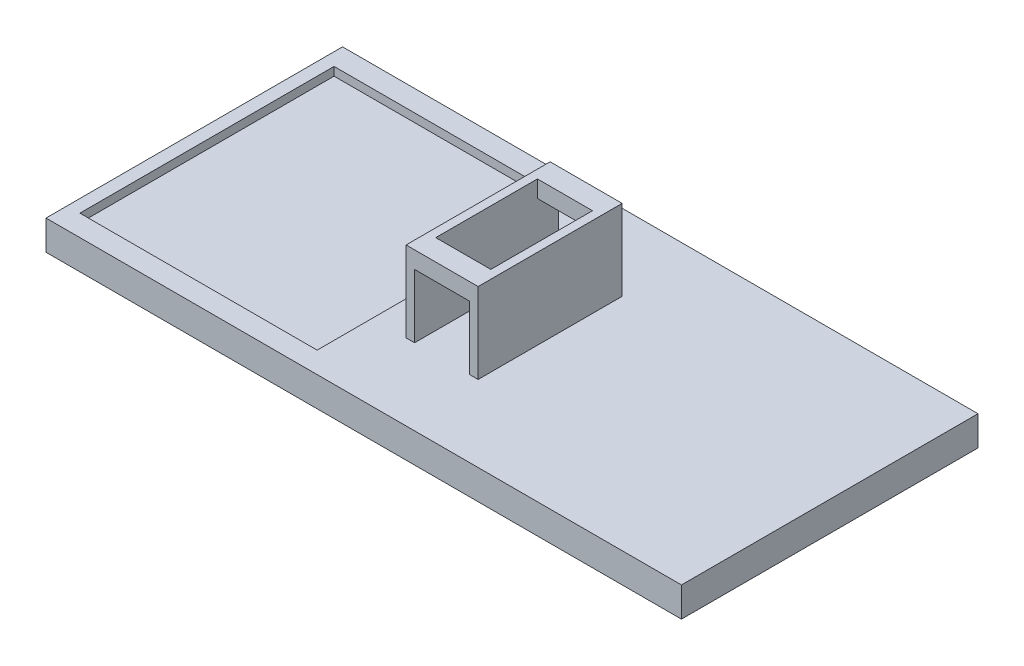
ISO-10303-21;
HEADER;
FILE_DESCRIPTION(('STEP AP214'),'2;1');
FILE_NAME('part.step','',(''),(''),'','','');
FILE_SCHEMA(('AUTOMOTIVE_DESIGN { 1 0 10303 214 1 1 1 1 }'));
ENDSEC;
DATA;
#1=APPLICATION_CONTEXT('core data for automotive mechanical design processes');
#2=APPLICATION_PROTOCOL_DEFINITION('international standard','automotive_design',2000,#1);
#3=PRODUCT_CONTEXT('',#1,'mechanical');
#4=PRODUCT('Part','Part','',(#3));
#5=PRODUCT_RELATED_PRODUCT_CATEGORY('part','',(#4));
#6=PRODUCT_DEFINITION_FORMATION('','',#4);
#7=PRODUCT_DEFINITION_CONTEXT('part definition',#1,'design');
#8=PRODUCT_DEFINITION('design','',#6,#7);
#9=PRODUCT_DEFINITION_SHAPE('','',#8);
#10=(LENGTH_UNIT() NAMED_UNIT(*) SI_UNIT(.MILLI.,.METRE.));
#11=(NAMED_UNIT(*) PLANE_ANGLE_UNIT() SI_UNIT($,.RADIAN.));
#12=(NAMED_UNIT(*) SI_UNIT($,.STERADIAN.) SOLID_ANGLE_UNIT());
#13=UNCERTAINTY_MEASURE_WITH_UNIT(LENGTH_MEASURE(1.E-05),#10,'distance_accuracy_value','');
#14=(GEOMETRIC_REPRESENTATION_CONTEXT(3) GLOBAL_UNCERTAINTY_ASSIGNED_CONTEXT((#13)) GLOBAL_UNIT_ASSIGNED_CONTEXT((#10,
#11,#12)) REPRESENTATION_CONTEXT('',''));
#15=CARTESIAN_POINT('',(0.,0.,0.));
#16=DIRECTION('',(0.,0.,1.));
#17=DIRECTION('',(1.,0.,0.));
#18=AXIS2_PLACEMENT_3D('',#15,#16,#17);
#19=CARTESIAN_POINT('',(0.,5.,0.));
#20=DIRECTION('',(0.,0.,-1.));
#21=DIRECTION('',(-1.,0.,0.));
#22=AXIS2_PLACEMENT_3D('',#19,#20,#21);
#23=PLANE('',#22);
#24=DIRECTION('',(1.,0.,0.));
#25=VECTOR('',#24,1.);
#26=CARTESIAN_POINT('',(0.,0.,0.));
#27=LINE('',#26,#25);
#28=CARTESIAN_POINT('',(0.,0.,0.));
#29=VERTEX_POINT('',#28);
#30=CARTESIAN_POINT('',(150.,0.,0.));
#31=VERTEX_POINT('',#30);
#32=EDGE_CURVE('E283',#29,#31,#27,.T.);
#33=ORIENTED_EDGE('',*,*,#32,.T.);
#34=DIRECTION('',(0.,-1.,0.));
#35=VECTOR('',#34,1.);
#36=CARTESIAN_POINT('',(150.,5.,0.));
#37=LINE('',#36,#35);
#38=CARTESIAN_POINT('',(150.,7.,0.));
#39=VERTEX_POINT('',#38);
#40=EDGE_CURVE('E288',#39,#31,#37,.T.);
#41=ORIENTED_EDGE('',*,*,#40,.F.);
#42=DIRECTION('',(1.,0.,0.));
#43=VECTOR('',#42,1.);
#44=CARTESIAN_POINT('',(0.,7.,0.));
#45=LINE('',#44,#43);
#46=CARTESIAN_POINT('',(0.,7.,0.));
#47=VERTEX_POINT('',#46);
#48=EDGE_CURVE('E253',#47,#39,#45,.T.);
#49=ORIENTED_EDGE('',*,*,#48,.F.);
#50=DIRECTION('',(0.,-1.,0.));
#51=VECTOR('',#50,1.);
#52=CARTESIAN_POINT('',(0.,5.,0.));
#53=LINE('',#52,#51);
#54=EDGE_CURVE('E42',#47,#29,#53,.T.);
#55=ORIENTED_EDGE('',*,*,#54,.T.);
#56=EDGE_LOOP('',(#33,#41,#49,#55));
#57=FACE_BOUND('',#56,.T.);
#58=ADVANCED_FACE('F34',(#57),#23,.F.);
#59=CARTESIAN_POINT('',(150.,5.,0.));
#60=DIRECTION('',(-1.,0.,0.));
#61=DIRECTION('',(0.,0.,1.));
#62=AXIS2_PLACEMENT_3D('',#59,#60,#61);
#63=PLANE('',#62);
#64=DIRECTION('',(0.,0.,-1.));
#65=VECTOR('',#64,1.);
#66=CARTESIAN_POINT('',(150.,0.,0.));
#67=LINE('',#66,#65);
#68=CARTESIAN_POINT('',(150.,0.,-70.));
#69=VERTEX_POINT('',#68);
#70=EDGE_CURVE('E280',#31,#69,#67,.T.);
#71=ORIENTED_EDGE('',*,*,#70,.T.);
#72=DIRECTION('',(0.,-1.,0.));
#73=VECTOR('',#72,1.);
#74=CARTESIAN_POINT('',(150.,5.,-70.));
#75=LINE('',#74,#73);
#76=CARTESIAN_POINT('',(150.,7.,-70.));
#77=VERTEX_POINT('',#76);
#78=EDGE_CURVE('E291',#77,#69,#75,.T.);
#79=ORIENTED_EDGE('',*,*,#78,.F.);
#80=DIRECTION('',(0.,0.,-1.));
#81=VECTOR('',#80,1.);
#82=CARTESIAN_POINT('',(150.,7.,0.));
#83=LINE('',#82,#81);
#84=EDGE_CURVE('E256',#39,#77,#83,.T.);
#85=ORIENTED_EDGE('',*,*,#84,.F.);
#86=ORIENTED_EDGE('',*,*,#40,.T.);
#87=EDGE_LOOP('',(#71,#79,#85,#86));
#88=FACE_BOUND('',#87,.T.);
#89=ADVANCED_FACE('F306',(#88),#63,.F.);
#90=CARTESIAN_POINT('',(0.,5.,-70.));
#91=DIRECTION('',(0.,0.,-1.));
#92=DIRECTION('',(-1.,0.,0.));
#93=AXIS2_PLACEMENT_3D('',#90,#91,#92);
#94=PLANE('',#93);
#95=DIRECTION('',(1.,0.,0.));
#96=VECTOR('',#95,1.);
#97=CARTESIAN_POINT('',(0.,0.,-70.));
#98=LINE('',#97,#96);
#99=CARTESIAN_POINT('',(0.,0.,-70.));
#100=VERTEX_POINT('',#99);
#101=EDGE_CURVE('E277',#100,#69,#98,.T.);
#102=ORIENTED_EDGE('',*,*,#101,.F.);
#103=DIRECTION('',(0.,-1.,0.));
#104=VECTOR('',#103,1.);
#105=CARTESIAN_POINT('',(0.,5.,-70.));
#106=LINE('',#105,#104);
#107=CARTESIAN_POINT('',(0.,7.,-70.));
#108=VERTEX_POINT('',#107);
#109=EDGE_CURVE('E285',#108,#100,#106,.T.);
#110=ORIENTED_EDGE('',*,*,#109,.F.);
#111=DIRECTION('',(-1.,0.,0.));
#112=VECTOR('',#111,1.);
#113=CARTESIAN_POINT('',(0.,7.,-70.));
#114=LINE('',#113,#112);
#115=EDGE_CURVE('E259',#77,#108,#114,.T.);
#116=ORIENTED_EDGE('',*,*,#115,.F.);
#117=ORIENTED_EDGE('',*,*,#78,.T.);
#118=EDGE_LOOP('',(#102,#110,#116,#117));
#119=FACE_BOUND('',#118,.T.);
#120=ADVANCED_FACE('F297',(#119),#94,.T.);
#121=CARTESIAN_POINT('',(0.,5.,-5.));
#122=DIRECTION('',(-1.,0.,0.));
#123=DIRECTION('',(0.,0.,1.));
#124=AXIS2_PLACEMENT_3D('',#121,#122,#123);
#125=PLANE('',#124);
#126=DIRECTION('',(0.,0.,-1.));
#127=VECTOR('',#126,1.);
#128=CARTESIAN_POINT('',(0.,0.,-5.));
#129=LINE('',#128,#127);
#130=EDGE_CURVE('E274',#29,#100,#129,.T.);
#131=ORIENTED_EDGE('',*,*,#130,.F.);
#132=ORIENTED_EDGE('',*,*,#54,.F.);
#133=DIRECTION('',(0.,0.,1.));
#134=VECTOR('',#133,1.);
#135=CARTESIAN_POINT('',(0.,7.,0.));
#136=LINE('',#135,#134);
#137=EDGE_CURVE('E250',#108,#47,#136,.T.);
#138=ORIENTED_EDGE('',*,*,#137,.F.);
#139=ORIENTED_EDGE('',*,*,#109,.T.);
#140=EDGE_LOOP('',(#131,#132,#138,#139));
#141=FACE_BOUND('',#140,.T.);
#142=ADVANCED_FACE('F36',(#141),#125,.T.);
#143=CARTESIAN_POINT('',(0.,0.,0.));
#144=DIRECTION('',(0.,-1.,0.));
#145=DIRECTION('',(0.,0.,-1.));
#146=AXIS2_PLACEMENT_3D('',#143,#144,#145);
#147=PLANE('',#146);
#148=ORIENTED_EDGE('',*,*,#32,.F.);
#149=ORIENTED_EDGE('',*,*,#130,.T.);
#150=ORIENTED_EDGE('',*,*,#101,.T.);
#151=ORIENTED_EDGE('',*,*,#70,.F.);
#152=EDGE_LOOP('',(#148,#149,#150,#151));
#153=FACE_BOUND('',#152,.T.);
#154=ADVANCED_FACE('F301',(#153),#147,.T.);
#155=CARTESIAN_POINT('',(59.,7.,-65.));
#156=DIRECTION('',(-1.,0.,0.));
#157=DIRECTION('',(0.,0.,1.));
#158=AXIS2_PLACEMENT_3D('',#155,#156,#157);
#159=PLANE('',#158);
#160=DIRECTION('',(0.,0.,-1.));
#161=VECTOR('',#160,1.);
#162=CARTESIAN_POINT('',(59.,5.,0.));
#163=LINE('',#162,#161);
#164=CARTESIAN_POINT('',(59.,5.,-5.));
#165=VERTEX_POINT('',#164);
#166=CARTESIAN_POINT('',(59.,5.,-65.));
#167=VERTEX_POINT('',#166);
#168=EDGE_CURVE('E271',#165,#167,#163,.T.);
#169=ORIENTED_EDGE('',*,*,#168,.F.);
#170=DIRECTION('',(0.,-1.,0.));
#171=VECTOR('',#170,1.);
#172=CARTESIAN_POINT('',(59.,7.,-5.));
#173=LINE('',#172,#171);
#174=CARTESIAN_POINT('',(59.,7.,-5.));
#175=VERTEX_POINT('',#174);
#176=EDGE_CURVE('E239',#175,#165,#173,.T.);
#177=ORIENTED_EDGE('',*,*,#176,.F.);
#178=DIRECTION('',(0.,0.,-1.));
#179=VECTOR('',#178,1.);
#180=CARTESIAN_POINT('',(59.,7.,-65.));
#181=LINE('',#180,#179);
#182=CARTESIAN_POINT('',(59.,7.,-65.));
#183=VERTEX_POINT('',#182);
#184=EDGE_CURVE('E219',#175,#183,#181,.T.);
#185=ORIENTED_EDGE('',*,*,#184,.T.);
#186=DIRECTION('',(0.,-1.,0.));
#187=VECTOR('',#186,1.);
#188=CARTESIAN_POINT('',(59.,7.,-65.));
#189=LINE('',#188,#187);
#190=EDGE_CURVE('E247',#183,#167,#189,.T.);
#191=ORIENTED_EDGE('',*,*,#190,.T.);
#192=EDGE_LOOP('',(#169,#177,#185,#191));
#193=FACE_BOUND('',#192,.T.);
#194=ADVANCED_FACE('F338',(#193),#159,.T.);
#195=CARTESIAN_POINT('',(3.,7.,-65.));
#196=DIRECTION('',(0.,0.,1.));
#197=DIRECTION('',(1.,0.,0.));
#198=AXIS2_PLACEMENT_3D('',#195,#196,#197);
#199=PLANE('',#198);
#200=DIRECTION('',(-1.,0.,0.));
#201=VECTOR('',#200,1.);
#202=CARTESIAN_POINT('',(0.,5.,-65.));
#203=LINE('',#202,#201);
#204=CARTESIAN_POINT('',(3.,5.,-65.));
#205=VERTEX_POINT('',#204);
#206=EDGE_CURVE('E268',#167,#205,#203,.T.);
#207=ORIENTED_EDGE('',*,*,#206,.F.);
#208=ORIENTED_EDGE('',*,*,#190,.F.);
#209=DIRECTION('',(-1.,0.,0.));
#210=VECTOR('',#209,1.);
#211=CARTESIAN_POINT('',(3.,7.,-65.));
#212=LINE('',#211,#210);
#213=CARTESIAN_POINT('',(3.,7.,-65.));
#214=VERTEX_POINT('',#213);
#215=EDGE_CURVE('E232',#183,#214,#212,.T.);
#216=ORIENTED_EDGE('',*,*,#215,.T.);
#217=DIRECTION('',(0.,-1.,0.));
#218=VECTOR('',#217,1.);
#219=CARTESIAN_POINT('',(3.,7.,-65.));
#220=LINE('',#219,#218);
#221=EDGE_CURVE('E244',#214,#205,#220,.T.);
#222=ORIENTED_EDGE('',*,*,#221,.T.);
#223=EDGE_LOOP('',(#207,#208,#216,#222));
#224=FACE_BOUND('',#223,.T.);
#225=ADVANCED_FACE('F342',(#224),#199,.T.);
#226=CARTESIAN_POINT('',(3.,7.,-65.));
#227=DIRECTION('',(1.,0.,0.));
#228=DIRECTION('',(0.,0.,-1.));
#229=AXIS2_PLACEMENT_3D('',#226,#227,#228);
#230=PLANE('',#229);
#231=DIRECTION('',(0.,0.,1.));
#232=VECTOR('',#231,1.);
#233=CARTESIAN_POINT('',(3.,5.,0.));
#234=LINE('',#233,#232);
#235=CARTESIAN_POINT('',(3.,5.,-5.));
#236=VERTEX_POINT('',#235);
#237=EDGE_CURVE('E265',#205,#236,#234,.T.);
#238=ORIENTED_EDGE('',*,*,#237,.F.);
#239=ORIENTED_EDGE('',*,*,#221,.F.);
#240=DIRECTION('',(0.,0.,1.));
#241=VECTOR('',#240,1.);
#242=CARTESIAN_POINT('',(3.,7.,-65.));
#243=LINE('',#242,#241);
#244=CARTESIAN_POINT('',(3.,7.,-5.));
#245=VERTEX_POINT('',#244);
#246=EDGE_CURVE('E234',#214,#245,#243,.T.);
#247=ORIENTED_EDGE('',*,*,#246,.T.);
#248=DIRECTION('',(0.,-1.,0.));
#249=VECTOR('',#248,1.);
#250=CARTESIAN_POINT('',(3.,7.,-5.));
#251=LINE('',#250,#249);
#252=EDGE_CURVE('E241',#245,#236,#251,.T.);
#253=ORIENTED_EDGE('',*,*,#252,.T.);
#254=EDGE_LOOP('',(#238,#239,#247,#253));
#255=FACE_BOUND('',#254,.T.);
#256=ADVANCED_FACE('F347',(#255),#230,.T.);
#257=CARTESIAN_POINT('',(3.,7.,-5.));
#258=DIRECTION('',(0.,0.,-1.));
#259=DIRECTION('',(-1.,0.,0.));
#260=AXIS2_PLACEMENT_3D('',#257,#258,#259);
#261=PLANE('',#260);
#262=DIRECTION('',(1.,0.,0.));
#263=VECTOR('',#262,1.);
#264=CARTESIAN_POINT('',(0.,5.,-5.));
#265=LINE('',#264,#263);
#266=EDGE_CURVE('E262',#236,#165,#265,.T.);
#267=ORIENTED_EDGE('',*,*,#266,.F.);
#268=ORIENTED_EDGE('',*,*,#252,.F.);
#269=DIRECTION('',(1.,0.,0.));
#270=VECTOR('',#269,1.);
#271=CARTESIAN_POINT('',(3.,7.,-5.));
#272=LINE('',#271,#270);
#273=EDGE_CURVE('E237',#245,#175,#272,.T.);
#274=ORIENTED_EDGE('',*,*,#273,.T.);
#275=ORIENTED_EDGE('',*,*,#176,.T.);
#276=EDGE_LOOP('',(#267,#268,#274,#275));
#277=FACE_BOUND('',#276,.T.);
#278=ADVANCED_FACE('F354',(#277),#261,.T.);
#279=CARTESIAN_POINT('',(0.,5.,0.));
#280=DIRECTION('',(0.,-1.,0.));
#281=DIRECTION('',(0.,0.,-1.));
#282=AXIS2_PLACEMENT_3D('',#279,#280,#281);
#283=PLANE('',#282);
#284=ORIENTED_EDGE('',*,*,#266,.T.);
#285=ORIENTED_EDGE('',*,*,#168,.T.);
#286=ORIENTED_EDGE('',*,*,#206,.T.);
#287=ORIENTED_EDGE('',*,*,#237,.T.);
#288=EDGE_LOOP('',(#284,#285,#286,#287));
#289=FACE_BOUND('',#288,.T.);
#290=ADVANCED_FACE('F358',(#289),#283,.F.);
#291=CARTESIAN_POINT('',(82.,26.,0.));
#292=DIRECTION('',(-1.,0.,0.));
#293=DIRECTION('',(0.,0.,1.));
#294=AXIS2_PLACEMENT_3D('',#291,#292,#293);
#295=PLANE('',#294);
#296=DIRECTION('',(0.,-1.,0.));
#297=VECTOR('',#296,1.);
#298=CARTESIAN_POINT('',(82.,26.,-47.));
#299=LINE('',#298,#297);
#300=CARTESIAN_POINT('',(82.,26.,-47.));
#301=VERTEX_POINT('',#300);
#302=CARTESIAN_POINT('',(82.,22.,-47.));
#303=VERTEX_POINT('',#302);
#304=EDGE_CURVE('E207',#301,#303,#299,.T.);
#305=ORIENTED_EDGE('',*,*,#304,.T.);
#306=DIRECTION('',(0.,0.,1.));
#307=VECTOR('',#306,1.);
#308=CARTESIAN_POINT('',(82.,22.,-52.));
#309=LINE('',#308,#307);
#310=CARTESIAN_POINT('',(82.,22.,-52.));
#311=VERTEX_POINT('',#310);
#312=EDGE_CURVE('E404',#311,#303,#309,.T.);
#313=ORIENTED_EDGE('',*,*,#312,.F.);
#314=DIRECTION('',(0.,1.,0.));
#315=VECTOR('',#314,1.);
#316=CARTESIAN_POINT('',(82.,7.,-52.));
#317=LINE('',#316,#315);
#318=CARTESIAN_POINT('',(82.,7.,-52.));
#319=VERTEX_POINT('',#318);
#320=EDGE_CURVE('E188',#319,#311,#317,.T.);
#321=ORIENTED_EDGE('',*,*,#320,.F.);
#322=DIRECTION('',(0.,0.,-1.));
#323=VECTOR('',#322,1.);
#324=CARTESIAN_POINT('',(82.,7.,0.));
#325=LINE('',#324,#323);
#326=CARTESIAN_POINT('',(82.,7.,-18.));
#327=VERTEX_POINT('',#326);
#328=EDGE_CURVE('E49',#327,#319,#325,.T.);
#329=ORIENTED_EDGE('',*,*,#328,.F.);
#330=DIRECTION('',(0.,1.,0.));
#331=VECTOR('',#330,1.);
#332=CARTESIAN_POINT('',(82.,7.,-18.));
#333=LINE('',#332,#331);
#334=CARTESIAN_POINT('',(82.,22.,-18.));
#335=VERTEX_POINT('',#334);
#336=EDGE_CURVE('E402',#327,#335,#333,.T.);
#337=ORIENTED_EDGE('',*,*,#336,.T.);
#338=CARTESIAN_POINT('',(82.,22.,-23.));
#339=VERTEX_POINT('',#338);
#340=EDGE_CURVE('E394',#339,#335,#309,.T.);
#341=ORIENTED_EDGE('',*,*,#340,.F.);
#342=DIRECTION('',(0.,-1.,0.));
#343=VECTOR('',#342,1.);
#344=CARTESIAN_POINT('',(82.,26.,-23.));
#345=LINE('',#344,#343);
#346=CARTESIAN_POINT('',(82.,26.,-23.));
#347=VERTEX_POINT('',#346);
#348=EDGE_CURVE('E216',#347,#339,#345,.T.);
#349=ORIENTED_EDGE('',*,*,#348,.F.);
#350=DIRECTION('',(0.,0.,-1.));
#351=VECTOR('',#350,1.);
#352=CARTESIAN_POINT('',(82.,26.,0.));
#353=LINE('',#352,#351);
#354=EDGE_CURVE('E413',#347,#301,#353,.T.);
#355=ORIENTED_EDGE('',*,*,#354,.T.);
#356=EDGE_LOOP('',(#305,#313,#321,#329,#337,#341,#349,#355));
#357=FACE_BOUND('',#356,.T.);
#358=ADVANCED_FACE('F374',(#357),#295,.T.);
#359=CARTESIAN_POINT('',(0.,26.,-23.));
#360=DIRECTION('',(0.,0.,-1.));
#361=DIRECTION('',(-1.,0.,0.));
#362=AXIS2_PLACEMENT_3D('',#359,#360,#361);
#363=PLANE('',#362);
#364=DIRECTION('',(1.,0.,0.));
#365=VECTOR('',#364,1.);
#366=CARTESIAN_POINT('',(0.,22.,-23.));
#367=LINE('',#366,#365);
#368=CARTESIAN_POINT('',(69.,22.,-23.));
#369=VERTEX_POINT('',#368);
#370=EDGE_CURVE('E391',#369,#339,#367,.T.);
#371=ORIENTED_EDGE('',*,*,#370,.F.);
#372=DIRECTION('',(0.,-1.,0.));
#373=VECTOR('',#372,1.);
#374=CARTESIAN_POINT('',(69.,26.,-23.));
#375=LINE('',#374,#373);
#376=CARTESIAN_POINT('',(69.,26.,-23.));
#377=VERTEX_POINT('',#376);
#378=EDGE_CURVE('E214',#377,#369,#375,.T.);
#379=ORIENTED_EDGE('',*,*,#378,.F.);
#380=DIRECTION('',(1.,0.,0.));
#381=VECTOR('',#380,1.);
#382=CARTESIAN_POINT('',(0.,26.,-23.));
#383=LINE('',#382,#381);
#384=EDGE_CURVE('E408',#377,#347,#383,.T.);
#385=ORIENTED_EDGE('',*,*,#384,.T.);
#386=ORIENTED_EDGE('',*,*,#348,.T.);
#387=EDGE_LOOP('',(#371,#379,#385,#386));
#388=FACE_BOUND('',#387,.T.);
#389=ADVANCED_FACE('F377',(#388),#363,.T.);
#390=CARTESIAN_POINT('',(69.,26.,0.));
#391=DIRECTION('',(1.,0.,0.));
#392=DIRECTION('',(0.,0.,-1.));
#393=AXIS2_PLACEMENT_3D('',#390,#391,#392);
#394=PLANE('',#393);
#395=ORIENTED_EDGE('',*,*,#378,.T.);
#396=DIRECTION('',(0.,0.,1.));
#397=VECTOR('',#396,1.);
#398=CARTESIAN_POINT('',(69.,22.,-52.));
#399=LINE('',#398,#397);
#400=CARTESIAN_POINT('',(69.,22.,-18.));
#401=VERTEX_POINT('',#400);
#402=EDGE_CURVE('E396',#369,#401,#399,.T.);
#403=ORIENTED_EDGE('',*,*,#402,.T.);
#404=DIRECTION('',(0.,-1.,0.));
#405=VECTOR('',#404,1.);
#406=CARTESIAN_POINT('',(69.,7.,-18.));
#407=LINE('',#406,#405);
#408=CARTESIAN_POINT('',(69.,7.,-18.));
#409=VERTEX_POINT('',#408);
#410=EDGE_CURVE('E177',#401,#409,#407,.T.);
#411=ORIENTED_EDGE('',*,*,#410,.T.);
#412=DIRECTION('',(0.,0.,1.));
#413=VECTOR('',#412,1.);
#414=CARTESIAN_POINT('',(69.,7.,0.));
#415=LINE('',#414,#413);
#416=CARTESIAN_POINT('',(69.,7.,-52.));
#417=VERTEX_POINT('',#416);
#418=EDGE_CURVE('E57',#417,#409,#415,.T.);
#419=ORIENTED_EDGE('',*,*,#418,.F.);
#420=DIRECTION('',(0.,-1.,0.));
#421=VECTOR('',#420,1.);
#422=CARTESIAN_POINT('',(69.,7.,-52.));
#423=LINE('',#422,#421);
#424=CARTESIAN_POINT('',(69.,22.,-52.));
#425=VERTEX_POINT('',#424);
#426=EDGE_CURVE('E174',#425,#417,#423,.T.);
#427=ORIENTED_EDGE('',*,*,#426,.F.);
#428=CARTESIAN_POINT('',(69.,22.,-47.));
#429=VERTEX_POINT('',#428);
#430=EDGE_CURVE('E397',#425,#429,#399,.T.);
#431=ORIENTED_EDGE('',*,*,#430,.T.);
#432=DIRECTION('',(0.,-1.,0.));
#433=VECTOR('',#432,1.);
#434=CARTESIAN_POINT('',(69.,26.,-47.));
#435=LINE('',#434,#433);
#436=CARTESIAN_POINT('',(69.,26.,-47.));
#437=VERTEX_POINT('',#436);
#438=EDGE_CURVE('E210',#437,#429,#435,.T.);
#439=ORIENTED_EDGE('',*,*,#438,.F.);
#440=DIRECTION('',(0.,0.,1.));
#441=VECTOR('',#440,1.);
#442=CARTESIAN_POINT('',(69.,26.,0.));
#443=LINE('',#442,#441);
#444=EDGE_CURVE('E412',#437,#377,#443,.T.);
#445=ORIENTED_EDGE('',*,*,#444,.T.);
#446=EDGE_LOOP('',(#395,#403,#411,#419,#427,#431,#439,#445));
#447=FACE_BOUND('',#446,.T.);
#448=ADVANCED_FACE('F172',(#447),#394,.T.);
#449=CARTESIAN_POINT('',(84.,26.,0.));
#450=DIRECTION('',(1.,0.,0.));
#451=DIRECTION('',(0.,0.,-1.));
#452=AXIS2_PLACEMENT_3D('',#449,#450,#451);
#453=PLANE('',#452);
#454=DIRECTION('',(0.,0.,1.));
#455=VECTOR('',#454,1.);
#456=CARTESIAN_POINT('',(84.,7.,0.));
#457=LINE('',#456,#455);
#458=CARTESIAN_POINT('',(84.,7.,-52.));
#459=VERTEX_POINT('',#458);
#460=CARTESIAN_POINT('',(84.,7.,-18.));
#461=VERTEX_POINT('',#460);
#462=EDGE_CURVE('E200',#459,#461,#457,.T.);
#463=ORIENTED_EDGE('',*,*,#462,.F.);
#464=DIRECTION('',(0.,-1.,0.));
#465=VECTOR('',#464,1.);
#466=CARTESIAN_POINT('',(84.,26.,-52.));
#467=LINE('',#466,#465);
#468=CARTESIAN_POINT('',(84.,26.,-52.));
#469=VERTEX_POINT('',#468);
#470=EDGE_CURVE('E211',#469,#459,#467,.T.);
#471=ORIENTED_EDGE('',*,*,#470,.F.);
#472=DIRECTION('',(0.,0.,1.));
#473=VECTOR('',#472,1.);
#474=CARTESIAN_POINT('',(84.,26.,0.));
#475=LINE('',#474,#473);
#476=CARTESIAN_POINT('',(84.,26.,-18.));
#477=VERTEX_POINT('',#476);
#478=EDGE_CURVE('E179',#469,#477,#475,.T.);
#479=ORIENTED_EDGE('',*,*,#478,.T.);
#480=DIRECTION('',(0.,-1.,0.));
#481=VECTOR('',#480,1.);
#482=CARTESIAN_POINT('',(84.,26.,-18.));
#483=LINE('',#482,#481);
#484=EDGE_CURVE('E220',#477,#461,#483,.T.);
#485=ORIENTED_EDGE('',*,*,#484,.T.);
#486=EDGE_LOOP('',(#463,#471,#479,#485));
#487=FACE_BOUND('',#486,.T.);
#488=ADVANCED_FACE('F360',(#487),#453,.T.);
#489=CARTESIAN_POINT('',(0.,26.,-52.));
#490=DIRECTION('',(0.,0.,-1.));
#491=DIRECTION('',(-1.,0.,0.));
#492=AXIS2_PLACEMENT_3D('',#489,#490,#491);
#493=PLANE('',#492);
#494=ORIENTED_EDGE('',*,*,#426,.T.);
#495=DIRECTION('',(1.,0.,0.));
#496=VECTOR('',#495,1.);
#497=CARTESIAN_POINT('',(0.,7.,-52.));
#498=LINE('',#497,#496);
#499=CARTESIAN_POINT('',(67.,7.,-52.));
#500=VERTEX_POINT('',#499);
#501=EDGE_CURVE('E184',#500,#417,#498,.T.);
#502=ORIENTED_EDGE('',*,*,#501,.F.);
#503=DIRECTION('',(0.,-1.,0.));
#504=VECTOR('',#503,1.);
#505=CARTESIAN_POINT('',(67.,26.,-52.));
#506=LINE('',#505,#504);
#507=CARTESIAN_POINT('',(67.,26.,-52.));
#508=VERTEX_POINT('',#507);
#509=EDGE_CURVE('E227',#508,#500,#506,.T.);
#510=ORIENTED_EDGE('',*,*,#509,.F.);
#511=DIRECTION('',(1.,0.,0.));
#512=VECTOR('',#511,1.);
#513=CARTESIAN_POINT('',(0.,26.,-52.));
#514=LINE('',#513,#512);
#515=EDGE_CURVE('E431',#508,#469,#514,.T.);
#516=ORIENTED_EDGE('',*,*,#515,.T.);
#517=ORIENTED_EDGE('',*,*,#470,.T.);
#518=EDGE_CURVE('E196',#319,#459,#498,.T.);
#519=ORIENTED_EDGE('',*,*,#518,.F.);
#520=ORIENTED_EDGE('',*,*,#320,.T.);
#521=DIRECTION('',(-1.,0.,0.));
#522=VECTOR('',#521,1.);
#523=CARTESIAN_POINT('',(69.,22.,-52.));
#524=LINE('',#523,#522);
#525=EDGE_CURVE('E187',#311,#425,#524,.T.);
#526=ORIENTED_EDGE('',*,*,#525,.T.);
#527=EDGE_LOOP('',(#494,#502,#510,#516,#517,#519,#520,#526));
#528=FACE_BOUND('',#527,.T.);
#529=ADVANCED_FACE('F183',(#528),#493,.T.);
#530=CARTESIAN_POINT('',(67.,26.,0.));
#531=DIRECTION('',(1.,0.,0.));
#532=DIRECTION('',(0.,0.,-1.));
#533=AXIS2_PLACEMENT_3D('',#530,#531,#532);
#534=PLANE('',#533);
#535=DIRECTION('',(0.,0.,1.));
#536=VECTOR('',#535,1.);
#537=CARTESIAN_POINT('',(67.,7.,0.));
#538=LINE('',#537,#536);
#539=CARTESIAN_POINT('',(67.,7.,-18.));
#540=VERTEX_POINT('',#539);
#541=EDGE_CURVE('E194',#500,#540,#538,.T.);
#542=ORIENTED_EDGE('',*,*,#541,.T.);
#543=DIRECTION('',(0.,-1.,0.));
#544=VECTOR('',#543,1.);
#545=CARTESIAN_POINT('',(67.,26.,-18.));
#546=LINE('',#545,#544);
#547=CARTESIAN_POINT('',(67.,26.,-18.));
#548=VERTEX_POINT('',#547);
#549=EDGE_CURVE('E223',#548,#540,#546,.T.);
#550=ORIENTED_EDGE('',*,*,#549,.F.);
#551=DIRECTION('',(0.,0.,1.));
#552=VECTOR('',#551,1.);
#553=CARTESIAN_POINT('',(67.,26.,0.));
#554=LINE('',#553,#552);
#555=EDGE_CURVE('E434',#508,#548,#554,.T.);
#556=ORIENTED_EDGE('',*,*,#555,.F.);
#557=ORIENTED_EDGE('',*,*,#509,.T.);
#558=EDGE_LOOP('',(#542,#550,#556,#557));
#559=FACE_BOUND('',#558,.T.);
#560=ADVANCED_FACE('F366',(#559),#534,.F.);
#561=CARTESIAN_POINT('',(0.,26.,-18.));
#562=DIRECTION('',(0.,0.,-1.));
#563=DIRECTION('',(-1.,0.,0.));
#564=AXIS2_PLACEMENT_3D('',#561,#562,#563);
#565=PLANE('',#564);
#566=DIRECTION('',(1.,0.,0.));
#567=VECTOR('',#566,1.);
#568=CARTESIAN_POINT('',(0.,7.,-18.));
#569=LINE('',#568,#567);
#570=EDGE_CURVE('E204',#540,#409,#569,.T.);
#571=ORIENTED_EDGE('',*,*,#570,.T.);
#572=ORIENTED_EDGE('',*,*,#410,.F.);
#573=DIRECTION('',(-1.,0.,0.));
#574=VECTOR('',#573,1.);
#575=CARTESIAN_POINT('',(69.,22.,-18.));
#576=LINE('',#575,#574);
#577=EDGE_CURVE('E189',#335,#401,#576,.T.);
#578=ORIENTED_EDGE('',*,*,#577,.F.);
#579=ORIENTED_EDGE('',*,*,#336,.F.);
#580=EDGE_CURVE('E198',#327,#461,#569,.T.);
#581=ORIENTED_EDGE('',*,*,#580,.T.);
#582=ORIENTED_EDGE('',*,*,#484,.F.);
#583=DIRECTION('',(1.,0.,0.));
#584=VECTOR('',#583,1.);
#585=CARTESIAN_POINT('',(0.,26.,-18.));
#586=LINE('',#585,#584);
#587=EDGE_CURVE('E416',#548,#477,#586,.T.);
#588=ORIENTED_EDGE('',*,*,#587,.F.);
#589=ORIENTED_EDGE('',*,*,#549,.T.);
#590=EDGE_LOOP('',(#571,#572,#578,#579,#581,#582,#588,#589));
#591=FACE_BOUND('',#590,.T.);
#592=ADVANCED_FACE('F369',(#591),#565,.F.);
#593=CARTESIAN_POINT('',(0.,26.,-47.));
#594=DIRECTION('',(0.,0.,-1.));
#595=DIRECTION('',(-1.,0.,0.));
#596=AXIS2_PLACEMENT_3D('',#593,#594,#595);
#597=PLANE('',#596);
#598=ORIENTED_EDGE('',*,*,#438,.T.);
#599=DIRECTION('',(1.,0.,0.));
#600=VECTOR('',#599,1.);
#601=CARTESIAN_POINT('',(0.,22.,-47.));
#602=LINE('',#601,#600);
#603=EDGE_CURVE('E11',#429,#303,#602,.T.);
#604=ORIENTED_EDGE('',*,*,#603,.T.);
#605=ORIENTED_EDGE('',*,*,#304,.F.);
#606=DIRECTION('',(1.,0.,0.));
#607=VECTOR('',#606,1.);
#608=CARTESIAN_POINT('',(0.,26.,-47.));
#609=LINE('',#608,#607);
#610=EDGE_CURVE('E224',#437,#301,#609,.T.);
#611=ORIENTED_EDGE('',*,*,#610,.F.);
#612=EDGE_LOOP('',(#598,#604,#605,#611));
#613=FACE_BOUND('',#612,.T.);
#614=ADVANCED_FACE('F319',(#613),#597,.F.);
#615=CARTESIAN_POINT('',(0.,26.,0.));
#616=DIRECTION('',(0.,1.,0.));
#617=DIRECTION('',(0.,0.,1.));
#618=AXIS2_PLACEMENT_3D('',#615,#616,#617);
#619=PLANE('',#618);
#620=ORIENTED_EDGE('',*,*,#478,.F.);
#621=ORIENTED_EDGE('',*,*,#515,.F.);
#622=ORIENTED_EDGE('',*,*,#555,.T.);
#623=ORIENTED_EDGE('',*,*,#587,.T.);
#624=EDGE_LOOP('',(#620,#621,#622,#623));
#625=FACE_BOUND('',#624,.T.);
#626=ORIENTED_EDGE('',*,*,#354,.F.);
#627=ORIENTED_EDGE('',*,*,#384,.F.);
#628=ORIENTED_EDGE('',*,*,#444,.F.);
#629=ORIENTED_EDGE('',*,*,#610,.T.);
#630=EDGE_LOOP('',(#626,#627,#628,#629));
#631=FACE_BOUND('',#630,.T.);
#632=ADVANCED_FACE('F310',(#625,#631),#619,.T.);
#633=CARTESIAN_POINT('',(0.,7.,0.));
#634=DIRECTION('',(0.,-1.,0.));
#635=DIRECTION('',(0.,0.,-1.));
#636=AXIS2_PLACEMENT_3D('',#633,#634,#635);
#637=PLANE('',#636);
#638=ORIENTED_EDGE('',*,*,#580,.F.);
#639=ORIENTED_EDGE('',*,*,#328,.T.);
#640=ORIENTED_EDGE('',*,*,#518,.T.);
#641=ORIENTED_EDGE('',*,*,#462,.T.);
#642=EDGE_LOOP('',(#638,#639,#640,#641));
#643=FACE_BOUND('',#642,.T.);
#644=ORIENTED_EDGE('',*,*,#418,.T.);
#645=ORIENTED_EDGE('',*,*,#570,.F.);
#646=ORIENTED_EDGE('',*,*,#541,.F.);
#647=ORIENTED_EDGE('',*,*,#501,.T.);
#648=EDGE_LOOP('',(#644,#645,#646,#647));
#649=FACE_BOUND('',#648,.T.);
#650=ORIENTED_EDGE('',*,*,#184,.F.);
#651=ORIENTED_EDGE('',*,*,#273,.F.);
#652=ORIENTED_EDGE('',*,*,#246,.F.);
#653=ORIENTED_EDGE('',*,*,#215,.F.);
#654=EDGE_LOOP('',(#650,#651,#652,#653));
#655=FACE_BOUND('',#654,.T.);
#656=ORIENTED_EDGE('',*,*,#137,.T.);
#657=ORIENTED_EDGE('',*,*,#48,.T.);
#658=ORIENTED_EDGE('',*,*,#84,.T.);
#659=ORIENTED_EDGE('',*,*,#115,.T.);
#660=EDGE_LOOP('',(#656,#657,#658,#659));
#661=FACE_BOUND('',#660,.T.);
#662=ADVANCED_FACE('F191',(#643,#649,#655,#661),#637,.F.);
#663=CARTESIAN_POINT('',(69.,22.,-52.));
#664=DIRECTION('',(0.,1.,0.));
#665=DIRECTION('',(0.,0.,1.));
#666=AXIS2_PLACEMENT_3D('',#663,#664,#665);
#667=PLANE('',#666);
#668=ORIENTED_EDGE('',*,*,#430,.F.);
#669=ORIENTED_EDGE('',*,*,#525,.F.);
#670=ORIENTED_EDGE('',*,*,#312,.T.);
#671=ORIENTED_EDGE('',*,*,#603,.F.);
#672=EDGE_LOOP('',(#668,#669,#670,#671));
#673=FACE_BOUND('',#672,.T.);
#674=ADVANCED_FACE('F309',(#673),#667,.F.);
#675=ORIENTED_EDGE('',*,*,#370,.T.);
#676=ORIENTED_EDGE('',*,*,#340,.T.);
#677=ORIENTED_EDGE('',*,*,#577,.T.);
#678=ORIENTED_EDGE('',*,*,#402,.F.);
#679=EDGE_LOOP('',(#675,#676,#677,#678));
#680=FACE_BOUND('',#679,.T.);
#681=ADVANCED_FACE('F316',(#680),#667,.F.);
#682=CLOSED_SHELL('',(#58,#89,#120,#142,#154,#194,#225,#256,#278,#290,#358,#389,#448,#488,#529,
#560,#592,#614,#632,#662,#674,#681));
#683=MANIFOLD_SOLID_BREP('B2',#682);
#684=ADVANCED_BREP_SHAPE_REPRESENTATION('',(#18,#683),#14);
#685=SHAPE_DEFINITION_REPRESENTATION(#9,#684);
ENDSEC;
END-ISO-10303-21;
